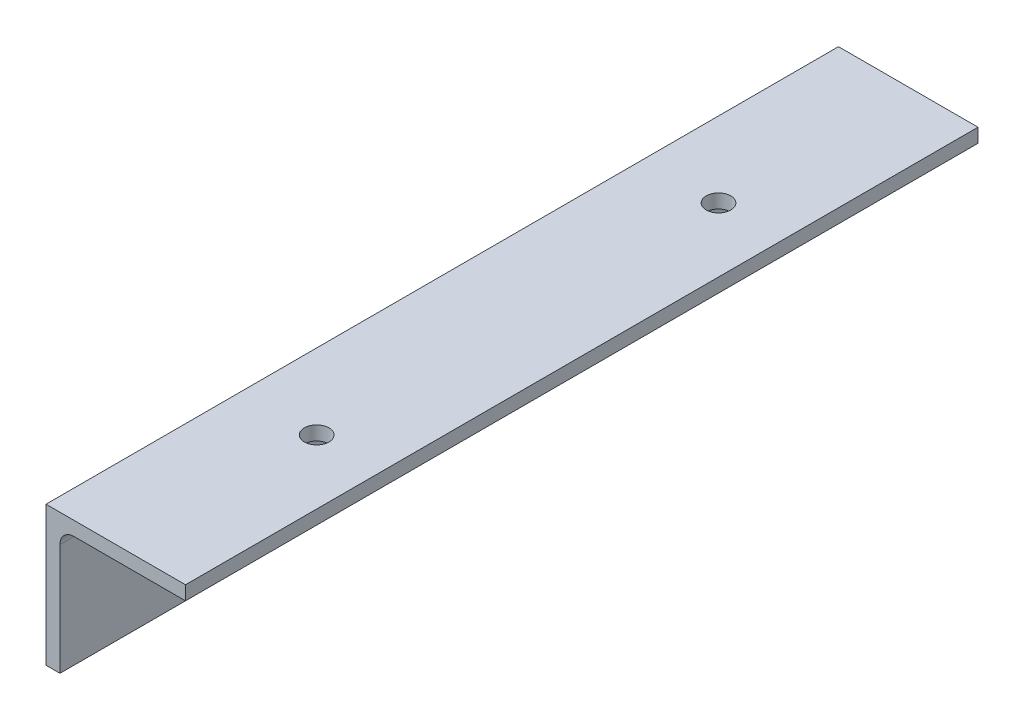
ISO-10303-21;
HEADER;
FILE_DESCRIPTION(('STEP AP214'),'2;1');
FILE_NAME('part.step','',(''),(''),'','','');
FILE_SCHEMA(('AUTOMOTIVE_DESIGN { 1 0 10303 214 1 1 1 1 }'));
ENDSEC;
DATA;
#1=APPLICATION_CONTEXT('core data for automotive mechanical design processes');
#2=APPLICATION_PROTOCOL_DEFINITION('international standard','automotive_design',2000,#1);
#3=PRODUCT_CONTEXT('',#1,'mechanical');
#4=PRODUCT('Part','Part','',(#3));
#5=PRODUCT_RELATED_PRODUCT_CATEGORY('part','',(#4));
#6=PRODUCT_DEFINITION_FORMATION('','',#4);
#7=PRODUCT_DEFINITION_CONTEXT('part definition',#1,'design');
#8=PRODUCT_DEFINITION('design','',#6,#7);
#9=PRODUCT_DEFINITION_SHAPE('','',#8);
#10=(LENGTH_UNIT() NAMED_UNIT(*) SI_UNIT(.MILLI.,.METRE.));
#11=(NAMED_UNIT(*) PLANE_ANGLE_UNIT() SI_UNIT($,.RADIAN.));
#12=(NAMED_UNIT(*) SI_UNIT($,.STERADIAN.) SOLID_ANGLE_UNIT());
#13=UNCERTAINTY_MEASURE_WITH_UNIT(LENGTH_MEASURE(1.E-05),#10,'distance_accuracy_value','');
#14=(GEOMETRIC_REPRESENTATION_CONTEXT(3) GLOBAL_UNCERTAINTY_ASSIGNED_CONTEXT((#13)) GLOBAL_UNIT_ASSIGNED_CONTEXT((#10,
#11,#12)) REPRESENTATION_CONTEXT('',''));
#15=CARTESIAN_POINT('',(0.,0.,0.));
#16=DIRECTION('',(0.,0.,1.));
#17=DIRECTION('',(1.,0.,0.));
#18=AXIS2_PLACEMENT_3D('',#15,#16,#17);
#19=CARTESIAN_POINT('',(0.,-50.,142.));
#20=DIRECTION('',(1.,0.,0.));
#21=DIRECTION('',(0.,0.,-1.));
#22=AXIS2_PLACEMENT_3D('',#19,#20,#21);
#23=PLANE('',#22);
#24=DIRECTION('',(0.,-1.,0.));
#25=VECTOR('',#24,1.);
#26=CARTESIAN_POINT('',(0.,-50.,-142.));
#27=LINE('',#26,#25);
#28=CARTESIAN_POINT('',(0.,0.,-142.));
#29=VERTEX_POINT('',#28);
#30=CARTESIAN_POINT('',(0.,-50.,-142.));
#31=VERTEX_POINT('',#30);
#32=EDGE_CURVE('E124',#29,#31,#27,.T.);
#33=ORIENTED_EDGE('',*,*,#32,.T.);
#34=DIRECTION('',(0.,0.,-1.));
#35=VECTOR('',#34,1.);
#36=CARTESIAN_POINT('',(0.,-50.,142.));
#37=LINE('',#36,#35);
#38=CARTESIAN_POINT('',(0.,-50.,142.));
#39=VERTEX_POINT('',#38);
#40=EDGE_CURVE('E106',#39,#31,#37,.T.);
#41=ORIENTED_EDGE('',*,*,#40,.F.);
#42=DIRECTION('',(0.,-1.,0.));
#43=VECTOR('',#42,1.);
#44=CARTESIAN_POINT('',(0.,-50.,142.));
#45=LINE('',#44,#43);
#46=CARTESIAN_POINT('',(0.,0.,142.));
#47=VERTEX_POINT('',#46);
#48=EDGE_CURVE('E112',#47,#39,#45,.T.);
#49=ORIENTED_EDGE('',*,*,#48,.F.);
#50=DIRECTION('',(0.,0.,-1.));
#51=VECTOR('',#50,1.);
#52=CARTESIAN_POINT('',(0.,0.,142.));
#53=LINE('',#52,#51);
#54=EDGE_CURVE('E138',#47,#29,#53,.T.);
#55=ORIENTED_EDGE('',*,*,#54,.T.);
#56=EDGE_LOOP('',(#33,#41,#49,#55));
#57=FACE_BOUND('',#56,.T.);
#58=ADVANCED_FACE('F43',(#57),#23,.F.);
#59=CARTESIAN_POINT('',(5.,-50.,142.));
#60=DIRECTION('',(0.,1.,0.));
#61=DIRECTION('',(0.,0.,1.));
#62=AXIS2_PLACEMENT_3D('',#59,#60,#61);
#63=PLANE('',#62);
#64=DIRECTION('',(1.,0.,0.));
#65=VECTOR('',#64,1.);
#66=CARTESIAN_POINT('',(5.,-50.,-142.));
#67=LINE('',#66,#65);
#68=CARTESIAN_POINT('',(5.,-50.,-142.));
#69=VERTEX_POINT('',#68);
#70=EDGE_CURVE('E147',#31,#69,#67,.T.);
#71=ORIENTED_EDGE('',*,*,#70,.T.);
#72=DIRECTION('',(0.,0.,-1.));
#73=VECTOR('',#72,1.);
#74=CARTESIAN_POINT('',(5.,-50.,142.));
#75=LINE('',#74,#73);
#76=CARTESIAN_POINT('',(5.,-50.,142.));
#77=VERTEX_POINT('',#76);
#78=EDGE_CURVE('E109',#77,#69,#75,.T.);
#79=ORIENTED_EDGE('',*,*,#78,.F.);
#80=DIRECTION('',(1.,0.,0.));
#81=VECTOR('',#80,1.);
#82=CARTESIAN_POINT('',(5.,-50.,142.));
#83=LINE('',#82,#81);
#84=EDGE_CURVE('E102',#39,#77,#83,.T.);
#85=ORIENTED_EDGE('',*,*,#84,.F.);
#86=ORIENTED_EDGE('',*,*,#40,.T.);
#87=EDGE_LOOP('',(#71,#79,#85,#86));
#88=FACE_BOUND('',#87,.T.);
#89=ADVANCED_FACE('F104',(#88),#63,.F.);
#90=CARTESIAN_POINT('',(5.,-5.00000000000001,142.));
#91=DIRECTION('',(-1.,0.,0.));
#92=DIRECTION('',(0.,-1.,0.));
#93=AXIS2_PLACEMENT_3D('',#90,#91,#92);
#94=PLANE('',#93);
#95=DIRECTION('',(0.,1.,0.));
#96=VECTOR('',#95,1.);
#97=CARTESIAN_POINT('',(5.,-5.00000000000001,-142.));
#98=LINE('',#97,#96);
#99=CARTESIAN_POINT('',(5.,-10.,-142.));
#100=VERTEX_POINT('',#99);
#101=EDGE_CURVE('E145',#69,#100,#98,.T.);
#102=ORIENTED_EDGE('',*,*,#101,.T.);
#103=DIRECTION('',(0.,0.,-1.));
#104=VECTOR('',#103,1.);
#105=CARTESIAN_POINT('',(5.,-10.,142.));
#106=LINE('',#105,#104);
#107=CARTESIAN_POINT('',(5.,-10.,142.));
#108=VERTEX_POINT('',#107);
#109=EDGE_CURVE('E58',#100,#108,#106,.F.);
#110=ORIENTED_EDGE('',*,*,#109,.T.);
#111=DIRECTION('',(0.,1.,0.));
#112=VECTOR('',#111,1.);
#113=CARTESIAN_POINT('',(5.,-5.00000000000001,142.));
#114=LINE('',#113,#112);
#115=EDGE_CURVE('E111',#77,#108,#114,.T.);
#116=ORIENTED_EDGE('',*,*,#115,.F.);
#117=ORIENTED_EDGE('',*,*,#78,.T.);
#118=EDGE_LOOP('',(#102,#110,#116,#117));
#119=FACE_BOUND('',#118,.T.);
#120=ADVANCED_FACE('F183',(#119),#94,.F.);
#121=CARTESIAN_POINT('',(50.,-5.,142.));
#122=DIRECTION('',(0.,1.,0.));
#123=DIRECTION('',(-1.,0.,0.));
#124=AXIS2_PLACEMENT_3D('',#121,#122,#123);
#125=PLANE('',#124);
#126=CARTESIAN_POINT('',(27.,-5.,72.));
#127=DIRECTION('',(0.,1.,0.));
#128=DIRECTION('',(-1.,0.,0.));
#129=AXIS2_PLACEMENT_3D('',#126,#127,#128);
#130=CIRCLE('',#129,4.39999999999997);
#131=CARTESIAN_POINT('',(22.6,-5.,72.));
#132=VERTEX_POINT('',#131);
#133=EDGE_CURVE('E162',#132,#132,#130,.F.);
#134=ORIENTED_EDGE('',*,*,#133,.F.);
#135=EDGE_LOOP('',(#134));
#136=FACE_BOUND('',#135,.T.);
#137=CARTESIAN_POINT('',(27.,-5.,-72.));
#138=DIRECTION('',(0.,1.,0.));
#139=DIRECTION('',(-1.,0.,0.));
#140=AXIS2_PLACEMENT_3D('',#137,#138,#139);
#141=CIRCLE('',#140,4.39999999999997);
#142=CARTESIAN_POINT('',(22.6,-5.,-72.));
#143=VERTEX_POINT('',#142);
#144=EDGE_CURVE('E150',#143,#143,#141,.T.);
#145=ORIENTED_EDGE('',*,*,#144,.T.);
#146=EDGE_LOOP('',(#145));
#147=FACE_BOUND('',#146,.T.);
#148=DIRECTION('',(1.,0.,0.));
#149=VECTOR('',#148,1.);
#150=CARTESIAN_POINT('',(50.,-5.,142.));
#151=LINE('',#150,#149);
#152=CARTESIAN_POINT('',(10.,-5.,142.));
#153=VERTEX_POINT('',#152);
#154=CARTESIAN_POINT('',(50.,-5.,142.));
#155=VERTEX_POINT('',#154);
#156=EDGE_CURVE('E154',#153,#155,#151,.T.);
#157=ORIENTED_EDGE('',*,*,#156,.F.);
#158=DIRECTION('',(0.,0.,-1.));
#159=VECTOR('',#158,1.);
#160=CARTESIAN_POINT('',(9.99999999999999,-5.,-142.));
#161=LINE('',#160,#159);
#162=CARTESIAN_POINT('',(10.,-5.,-142.));
#163=VERTEX_POINT('',#162);
#164=EDGE_CURVE('E125',#153,#163,#161,.T.);
#165=ORIENTED_EDGE('',*,*,#164,.T.);
#166=DIRECTION('',(1.,0.,0.));
#167=VECTOR('',#166,1.);
#168=CARTESIAN_POINT('',(50.,-5.,-142.));
#169=LINE('',#168,#167);
#170=CARTESIAN_POINT('',(50.,-5.,-142.));
#171=VERTEX_POINT('',#170);
#172=EDGE_CURVE('E143',#163,#171,#169,.T.);
#173=ORIENTED_EDGE('',*,*,#172,.T.);
#174=DIRECTION('',(0.,0.,-1.));
#175=VECTOR('',#174,1.);
#176=CARTESIAN_POINT('',(50.,-5.,142.));
#177=LINE('',#176,#175);
#178=EDGE_CURVE('E129',#155,#171,#177,.T.);
#179=ORIENTED_EDGE('',*,*,#178,.F.);
#180=EDGE_LOOP('',(#157,#165,#173,#179));
#181=FACE_BOUND('',#180,.T.);
#182=ADVANCED_FACE('F179',(#136,#147,#181),#125,.F.);
#183=CARTESIAN_POINT('',(50.,0.,142.));
#184=DIRECTION('',(-1.,0.,0.));
#185=DIRECTION('',(0.,0.,1.));
#186=AXIS2_PLACEMENT_3D('',#183,#184,#185);
#187=PLANE('',#186);
#188=DIRECTION('',(0.,1.,0.));
#189=VECTOR('',#188,1.);
#190=CARTESIAN_POINT('',(50.,0.,-142.));
#191=LINE('',#190,#189);
#192=CARTESIAN_POINT('',(50.,0.,-142.));
#193=VERTEX_POINT('',#192);
#194=EDGE_CURVE('E141',#171,#193,#191,.T.);
#195=ORIENTED_EDGE('',*,*,#194,.T.);
#196=DIRECTION('',(0.,0.,-1.));
#197=VECTOR('',#196,1.);
#198=CARTESIAN_POINT('',(50.,0.,142.));
#199=LINE('',#198,#197);
#200=CARTESIAN_POINT('',(50.,0.,142.));
#201=VERTEX_POINT('',#200);
#202=EDGE_CURVE('E135',#201,#193,#199,.T.);
#203=ORIENTED_EDGE('',*,*,#202,.F.);
#204=DIRECTION('',(0.,1.,0.));
#205=VECTOR('',#204,1.);
#206=CARTESIAN_POINT('',(50.,0.,142.));
#207=LINE('',#206,#205);
#208=EDGE_CURVE('E152',#155,#201,#207,.T.);
#209=ORIENTED_EDGE('',*,*,#208,.F.);
#210=ORIENTED_EDGE('',*,*,#178,.T.);
#211=EDGE_LOOP('',(#195,#203,#209,#210));
#212=FACE_BOUND('',#211,.T.);
#213=ADVANCED_FACE('F182',(#212),#187,.F.);
#214=CARTESIAN_POINT('',(0.,0.,142.));
#215=DIRECTION('',(0.,-1.,0.));
#216=DIRECTION('',(0.,0.,-1.));
#217=AXIS2_PLACEMENT_3D('',#214,#215,#216);
#218=PLANE('',#217);
#219=CARTESIAN_POINT('',(27.,0.,72.));
#220=DIRECTION('',(0.,-1.,0.));
#221=DIRECTION('',(0.,0.,-1.));
#222=AXIS2_PLACEMENT_3D('',#219,#220,#221);
#223=CIRCLE('',#222,4.39999999999997);
#224=CARTESIAN_POINT('',(27.,0.,67.6000000000001));
#225=VERTEX_POINT('',#224);
#226=EDGE_CURVE('E165',#225,#225,#223,.T.);
#227=ORIENTED_EDGE('',*,*,#226,.T.);
#228=EDGE_LOOP('',(#227));
#229=FACE_BOUND('',#228,.T.);
#230=CARTESIAN_POINT('',(27.,0.,-72.));
#231=DIRECTION('',(0.,1.,0.));
#232=DIRECTION('',(0.,0.,1.));
#233=AXIS2_PLACEMENT_3D('',#230,#231,#232);
#234=CIRCLE('',#233,4.39999999999997);
#235=CARTESIAN_POINT('',(27.,0.,-67.6000000000001));
#236=VERTEX_POINT('',#235);
#237=EDGE_CURVE('E159',#236,#236,#234,.T.);
#238=ORIENTED_EDGE('',*,*,#237,.F.);
#239=EDGE_LOOP('',(#238));
#240=FACE_BOUND('',#239,.T.);
#241=DIRECTION('',(-1.,0.,0.));
#242=VECTOR('',#241,1.);
#243=CARTESIAN_POINT('',(0.,0.,-142.));
#244=LINE('',#243,#242);
#245=EDGE_CURVE('E121',#193,#29,#244,.T.);
#246=ORIENTED_EDGE('',*,*,#245,.T.);
#247=ORIENTED_EDGE('',*,*,#54,.F.);
#248=DIRECTION('',(-1.,0.,0.));
#249=VECTOR('',#248,1.);
#250=CARTESIAN_POINT('',(0.,0.,142.));
#251=LINE('',#250,#249);
#252=EDGE_CURVE('E117',#201,#47,#251,.T.);
#253=ORIENTED_EDGE('',*,*,#252,.F.);
#254=ORIENTED_EDGE('',*,*,#202,.T.);
#255=EDGE_LOOP('',(#246,#247,#253,#254));
#256=FACE_BOUND('',#255,.T.);
#257=ADVANCED_FACE('F169',(#229,#240,#256),#218,.F.);
#258=CARTESIAN_POINT('',(0.,0.,142.));
#259=DIRECTION('',(0.,0.,-1.));
#260=DIRECTION('',(-1.,0.,0.));
#261=AXIS2_PLACEMENT_3D('',#258,#259,#260);
#262=PLANE('',#261);
#263=ORIENTED_EDGE('',*,*,#48,.T.);
#264=ORIENTED_EDGE('',*,*,#84,.T.);
#265=ORIENTED_EDGE('',*,*,#115,.T.);
#266=CARTESIAN_POINT('',(9.99999999999999,-10.,142.));
#267=DIRECTION('',(0.,0.,-1.));
#268=DIRECTION('',(-1.,0.,0.));
#269=AXIS2_PLACEMENT_3D('',#266,#267,#268);
#270=CIRCLE('',#269,5.);
#271=EDGE_CURVE('E11',#108,#153,#270,.T.);
#272=ORIENTED_EDGE('',*,*,#271,.T.);
#273=ORIENTED_EDGE('',*,*,#156,.T.);
#274=ORIENTED_EDGE('',*,*,#208,.T.);
#275=ORIENTED_EDGE('',*,*,#252,.T.);
#276=EDGE_LOOP('',(#263,#264,#265,#272,#273,#274,#275));
#277=FACE_BOUND('',#276,.T.);
#278=ADVANCED_FACE('F115',(#277),#262,.F.);
#279=CARTESIAN_POINT('',(0.,0.,-142.));
#280=DIRECTION('',(0.,0.,-1.));
#281=DIRECTION('',(-1.,0.,0.));
#282=AXIS2_PLACEMENT_3D('',#279,#280,#281);
#283=PLANE('',#282);
#284=ORIENTED_EDGE('',*,*,#32,.F.);
#285=ORIENTED_EDGE('',*,*,#245,.F.);
#286=ORIENTED_EDGE('',*,*,#194,.F.);
#287=ORIENTED_EDGE('',*,*,#172,.F.);
#288=CARTESIAN_POINT('',(9.99999999999999,-10.,-142.));
#289=DIRECTION('',(0.,0.,-1.));
#290=DIRECTION('',(-1.,0.,0.));
#291=AXIS2_PLACEMENT_3D('',#288,#289,#290);
#292=CIRCLE('',#291,5.);
#293=EDGE_CURVE('E51',#163,#100,#292,.F.);
#294=ORIENTED_EDGE('',*,*,#293,.T.);
#295=ORIENTED_EDGE('',*,*,#101,.F.);
#296=ORIENTED_EDGE('',*,*,#70,.F.);
#297=EDGE_LOOP('',(#284,#285,#286,#287,#294,#295,#296));
#298=FACE_BOUND('',#297,.T.);
#299=ADVANCED_FACE('F193',(#298),#283,.T.);
#300=CARTESIAN_POINT('',(9.99999999999999,-10.,142.));
#301=DIRECTION('',(0.,0.,1.));
#302=DIRECTION('',(1.,0.,0.));
#303=AXIS2_PLACEMENT_3D('',#300,#301,#302);
#304=CYLINDRICAL_SURFACE('',#303,5.);
#305=ORIENTED_EDGE('',*,*,#271,.F.);
#306=ORIENTED_EDGE('',*,*,#109,.F.);
#307=ORIENTED_EDGE('',*,*,#293,.F.);
#308=ORIENTED_EDGE('',*,*,#164,.F.);
#309=EDGE_LOOP('',(#305,#306,#307,#308));
#310=FACE_BOUND('',#309,.T.);
#311=ADVANCED_FACE('F45',(#310),#304,.F.);
#312=CARTESIAN_POINT('',(27.,-10.,-72.));
#313=DIRECTION('',(0.,1.,0.));
#314=DIRECTION('',(0.,0.,1.));
#315=AXIS2_PLACEMENT_3D('',#312,#313,#314);
#316=CYLINDRICAL_SURFACE('',#315,4.39999999999997);
#317=ORIENTED_EDGE('',*,*,#237,.T.);
#318=EDGE_LOOP('',(#317));
#319=FACE_BOUND('',#318,.T.);
#320=ORIENTED_EDGE('',*,*,#144,.F.);
#321=EDGE_LOOP('',(#320));
#322=FACE_BOUND('',#321,.T.);
#323=ADVANCED_FACE('F175',(#319,#322),#316,.F.);
#324=CARTESIAN_POINT('',(27.,-10.,72.));
#325=DIRECTION('',(0.,1.,0.));
#326=DIRECTION('',(0.,0.,1.));
#327=AXIS2_PLACEMENT_3D('',#324,#325,#326);
#328=CYLINDRICAL_SURFACE('',#327,4.39999999999997);
#329=ORIENTED_EDGE('',*,*,#226,.F.);
#330=EDGE_LOOP('',(#329));
#331=FACE_BOUND('',#330,.T.);
#332=ORIENTED_EDGE('',*,*,#133,.T.);
#333=EDGE_LOOP('',(#332));
#334=FACE_BOUND('',#333,.T.);
#335=ADVANCED_FACE('F172',(#331,#334),#328,.F.);
#336=CLOSED_SHELL('',(#58,#89,#120,#182,#213,#257,#278,#299,#311,#323,#335));
#337=MANIFOLD_SOLID_BREP('B2',#336);
#338=ADVANCED_BREP_SHAPE_REPRESENTATION('',(#18,#337),#14);
#339=SHAPE_DEFINITION_REPRESENTATION(#9,#338);
ENDSEC;
END-ISO-10303-21;
